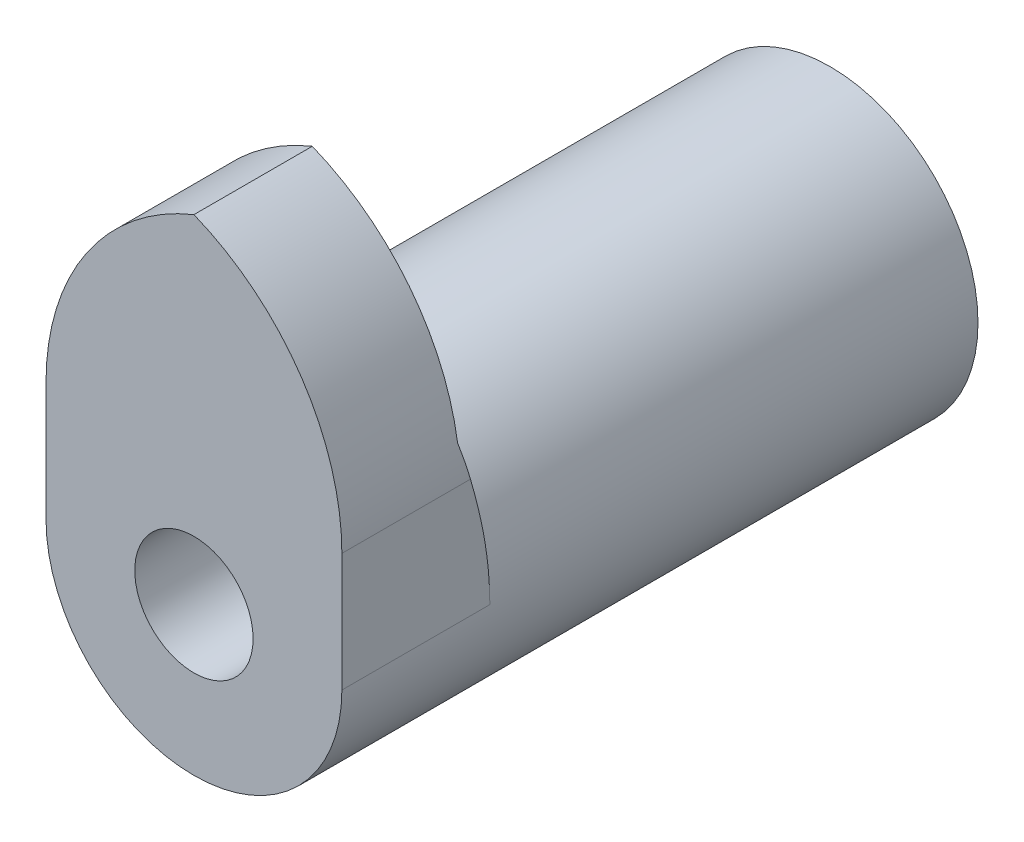
ISO-10303-21;
HEADER;
FILE_DESCRIPTION(('STEP AP214'),'2;1');
FILE_NAME('part.step','',(''),(''),'','','');
FILE_SCHEMA(('AUTOMOTIVE_DESIGN { 1 0 10303 214 1 1 1 1 }'));
ENDSEC;
DATA;
#1=APPLICATION_CONTEXT('core data for automotive mechanical design processes');
#2=APPLICATION_PROTOCOL_DEFINITION('international standard','automotive_design',2000,#1);
#3=PRODUCT_CONTEXT('',#1,'mechanical');
#4=PRODUCT('Part','Part','',(#3));
#5=PRODUCT_RELATED_PRODUCT_CATEGORY('part','',(#4));
#6=PRODUCT_DEFINITION_FORMATION('','',#4);
#7=PRODUCT_DEFINITION_CONTEXT('part definition',#1,'design');
#8=PRODUCT_DEFINITION('design','',#6,#7);
#9=PRODUCT_DEFINITION_SHAPE('','',#8);
#10=(LENGTH_UNIT() NAMED_UNIT(*) SI_UNIT(.MILLI.,.METRE.));
#11=(NAMED_UNIT(*) PLANE_ANGLE_UNIT() SI_UNIT($,.RADIAN.));
#12=(NAMED_UNIT(*) SI_UNIT($,.STERADIAN.) SOLID_ANGLE_UNIT());
#13=UNCERTAINTY_MEASURE_WITH_UNIT(LENGTH_MEASURE(1.E-05),#10,'distance_accuracy_value','');
#14=(GEOMETRIC_REPRESENTATION_CONTEXT(3) GLOBAL_UNCERTAINTY_ASSIGNED_CONTEXT((#13)) GLOBAL_UNIT_ASSIGNED_CONTEXT((#10,
#11,#12)) REPRESENTATION_CONTEXT('',''));
#15=CARTESIAN_POINT('',(0.,0.,0.));
#16=DIRECTION('',(0.,0.,1.));
#17=DIRECTION('',(1.,0.,0.));
#18=AXIS2_PLACEMENT_3D('',#15,#16,#17);
#19=CARTESIAN_POINT('',(0.,0.,21.5));
#20=DIRECTION('',(0.,0.,-1.));
#21=DIRECTION('',(-1.,0.,0.));
#22=AXIS2_PLACEMENT_3D('',#19,#20,#21);
#23=CYLINDRICAL_SURFACE('',#22,5.);
#24=CARTESIAN_POINT('',(0.,0.,0.));
#25=DIRECTION('',(0.,0.,1.));
#26=DIRECTION('',(1.,0.,0.));
#27=AXIS2_PLACEMENT_3D('',#24,#25,#26);
#28=CIRCLE('',#27,5.);
#29=CARTESIAN_POINT('',(5.,0.,0.));
#30=VERTEX_POINT('',#29);
#31=EDGE_CURVE('E123',#30,#30,#28,.T.);
#32=ORIENTED_EDGE('',*,*,#31,.T.);
#33=EDGE_LOOP('',(#32));
#34=FACE_BOUND('',#33,.T.);
#35=DIRECTION('',(0.,0.,1.));
#36=VECTOR('',#35,1.);
#37=CARTESIAN_POINT('',(-5.,0.,17.5));
#38=LINE('',#37,#36);
#39=CARTESIAN_POINT('',(-5.,0.,16.5));
#40=VERTEX_POINT('',#39);
#41=CARTESIAN_POINT('',(-5.,0.,21.5));
#42=VERTEX_POINT('',#41);
#43=EDGE_CURVE('E116',#40,#42,#38,.T.);
#44=ORIENTED_EDGE('',*,*,#43,.F.);
#45=CARTESIAN_POINT('',(0.,0.,16.5));
#46=DIRECTION('',(0.,0.,1.));
#47=DIRECTION('',(1.,0.,0.));
#48=AXIS2_PLACEMENT_3D('',#45,#46,#47);
#49=CIRCLE('',#48,5.);
#50=CARTESIAN_POINT('',(5.,0.,16.5));
#51=VERTEX_POINT('',#50);
#52=EDGE_CURVE('E113',#40,#51,#49,.F.);
#53=ORIENTED_EDGE('',*,*,#52,.T.);
#54=DIRECTION('',(0.,0.,1.));
#55=VECTOR('',#54,1.);
#56=CARTESIAN_POINT('',(5.,0.,17.5));
#57=LINE('',#56,#55);
#58=CARTESIAN_POINT('',(5.,0.,21.5));
#59=VERTEX_POINT('',#58);
#60=EDGE_CURVE('E100',#51,#59,#57,.T.);
#61=ORIENTED_EDGE('',*,*,#60,.T.);
#62=CARTESIAN_POINT('',(0.,0.,21.5));
#63=DIRECTION('',(0.,0.,1.));
#64=DIRECTION('',(1.,0.,0.));
#65=AXIS2_PLACEMENT_3D('',#62,#63,#64);
#66=CIRCLE('',#65,5.);
#67=EDGE_CURVE('E111',#42,#59,#66,.T.);
#68=ORIENTED_EDGE('',*,*,#67,.F.);
#69=EDGE_LOOP('',(#44,#53,#61,#68));
#70=FACE_BOUND('',#69,.T.);
#71=ADVANCED_FACE('F43',(#34,#70),#23,.T.);
#72=CARTESIAN_POINT('',(0.,0.,21.5));
#73=DIRECTION('',(0.,0.,1.));
#74=DIRECTION('',(1.,0.,0.));
#75=AXIS2_PLACEMENT_3D('',#72,#73,#74);
#76=PLANE('',#75);
#77=CARTESIAN_POINT('',(-3.,4.,21.5));
#78=DIRECTION('',(0.,0.,1.));
#79=DIRECTION('',(1.,0.,0.));
#80=AXIS2_PLACEMENT_3D('',#77,#78,#79);
#81=CIRCLE('',#80,8.);
#82=CARTESIAN_POINT('',(5.,4.,21.5));
#83=VERTEX_POINT('',#82);
#84=CARTESIAN_POINT('',(0.,11.4161984870957,21.5));
#85=VERTEX_POINT('',#84);
#86=EDGE_CURVE('E186',#83,#85,#81,.T.);
#87=ORIENTED_EDGE('',*,*,#86,.T.);
#88=CARTESIAN_POINT('',(3.,4.,21.5));
#89=DIRECTION('',(0.,0.,1.));
#90=DIRECTION('',(1.,0.,0.));
#91=AXIS2_PLACEMENT_3D('',#88,#89,#90);
#92=CIRCLE('',#91,8.);
#93=CARTESIAN_POINT('',(-5.,4.,21.5));
#94=VERTEX_POINT('',#93);
#95=EDGE_CURVE('E188',#85,#94,#92,.T.);
#96=ORIENTED_EDGE('',*,*,#95,.T.);
#97=DIRECTION('',(0.,1.,0.));
#98=VECTOR('',#97,1.);
#99=CARTESIAN_POINT('',(-5.,0.,21.5));
#100=LINE('',#99,#98);
#101=EDGE_CURVE('E106',#42,#94,#100,.T.);
#102=ORIENTED_EDGE('',*,*,#101,.F.);
#103=ORIENTED_EDGE('',*,*,#67,.T.);
#104=DIRECTION('',(0.,-1.,0.));
#105=VECTOR('',#104,1.);
#106=CARTESIAN_POINT('',(5.,0.,21.5));
#107=LINE('',#106,#105);
#108=EDGE_CURVE('E96',#83,#59,#107,.T.);
#109=ORIENTED_EDGE('',*,*,#108,.F.);
#110=EDGE_LOOP('',(#87,#96,#102,#103,#109));
#111=FACE_BOUND('',#110,.T.);
#112=CARTESIAN_POINT('',(0.,0.,21.5));
#113=DIRECTION('',(0.,0.,1.));
#114=DIRECTION('',(1.,0.,0.));
#115=AXIS2_PLACEMENT_3D('',#112,#113,#114);
#116=CIRCLE('',#115,2.);
#117=CARTESIAN_POINT('',(2.,0.,21.5));
#118=VERTEX_POINT('',#117);
#119=EDGE_CURVE('E127',#118,#118,#116,.T.);
#120=ORIENTED_EDGE('',*,*,#119,.F.);
#121=EDGE_LOOP('',(#120));
#122=FACE_BOUND('',#121,.T.);
#123=ADVANCED_FACE('F118',(#111,#122),#76,.T.);
#124=CARTESIAN_POINT('',(0.,0.,0.));
#125=DIRECTION('',(0.,0.,1.));
#126=DIRECTION('',(1.,0.,0.));
#127=AXIS2_PLACEMENT_3D('',#124,#125,#126);
#128=PLANE('',#127);
#129=ORIENTED_EDGE('',*,*,#31,.F.);
#130=EDGE_LOOP('',(#129));
#131=FACE_BOUND('',#130,.T.);
#132=CARTESIAN_POINT('',(0.,0.,0.));
#133=DIRECTION('',(0.,0.,1.));
#134=DIRECTION('',(1.,0.,0.));
#135=AXIS2_PLACEMENT_3D('',#132,#133,#134);
#136=CIRCLE('',#135,2.);
#137=CARTESIAN_POINT('',(2.,0.,0.));
#138=VERTEX_POINT('',#137);
#139=EDGE_CURVE('E115',#138,#138,#136,.T.);
#140=ORIENTED_EDGE('',*,*,#139,.T.);
#141=EDGE_LOOP('',(#140));
#142=FACE_BOUND('',#141,.T.);
#143=ADVANCED_FACE('F200',(#131,#142),#128,.F.);
#144=CARTESIAN_POINT('',(0.,0.,21.5));
#145=DIRECTION('',(0.,0.,-1.));
#146=DIRECTION('',(-1.,0.,0.));
#147=AXIS2_PLACEMENT_3D('',#144,#145,#146);
#148=CYLINDRICAL_SURFACE('',#147,2.);
#149=ORIENTED_EDGE('',*,*,#119,.T.);
#150=EDGE_LOOP('',(#149));
#151=FACE_BOUND('',#150,.T.);
#152=ORIENTED_EDGE('',*,*,#139,.F.);
#153=EDGE_LOOP('',(#152));
#154=FACE_BOUND('',#153,.T.);
#155=ADVANCED_FACE('F202',(#151,#154),#148,.F.);
#156=CARTESIAN_POINT('',(5.,0.,17.5));
#157=DIRECTION('',(-1.,0.,0.));
#158=DIRECTION('',(0.,0.,1.));
#159=AXIS2_PLACEMENT_3D('',#156,#157,#158);
#160=PLANE('',#159);
#161=CARTESIAN_POINT('',(5.,0.,16.5));
#162=CARTESIAN_POINT('',(5.,0.0874817058937852,16.499997095422));
#163=CARTESIAN_POINT('',(5.,0.174959774866362,16.5010709708579));
#164=CARTESIAN_POINT('',(5.,0.349860815592275,16.5053465241394));
#165=CARTESIAN_POINT('',(5.,0.437283789233235,16.5085481246194));
#166=CARTESIAN_POINT('',(5.,0.699315430332085,16.5213014988497));
#167=CARTESIAN_POINT('',(5.,0.873779473072869,16.5340018979144));
#168=CARTESIAN_POINT('',(5.,1.22140659670048,16.5672488332378));
#169=CARTESIAN_POINT('',(5.,1.39457201963819,16.587771417855));
#170=CARTESIAN_POINT('',(5.,1.73992098196719,16.6359371518027));
#171=CARTESIAN_POINT('',(5.,1.9121044073773,16.6635811111897));
#172=CARTESIAN_POINT('',(5.,2.25401895456,16.7249111430144));
#173=CARTESIAN_POINT('',(5.,2.42375875652857,16.7585492595013));
#174=CARTESIAN_POINT('',(5.,2.76207531088115,16.8311778009846));
#175=CARTESIAN_POINT('',(5.,2.93065208162815,16.8701681412713));
#176=CARTESIAN_POINT('',(5.,3.4348857322479,16.9940136096518));
#177=CARTESIAN_POINT('',(5.,3.76886762837503,17.0857095038762));
#178=CARTESIAN_POINT('',(5.,4.26871139930733,17.2335315383338));
#179=CARTESIAN_POINT('',(5.,4.4360493794505,17.2848277071709));
#180=CARTESIAN_POINT('',(5.,4.77016503510591,17.3903538704735));
#181=CARTESIAN_POINT('',(5.,4.9369409357545,17.4445894938397));
#182=CARTESIAN_POINT('',(5.,5.10333020068362,17.5));
#183=B_SPLINE_CURVE_WITH_KNOTS('',3,(#161,#162,#163,#164,#165,#166,#167,#168,#169,#170,#171,
#172,#173,#174,#175,#176,#177,#178,#179,#180,#181,#182),.UNSPECIFIED.,.F.,.F.,(4,2,2,2,2,2,2,2,
2,2,4),(0.,0.262431502923744,0.52485346417424,1.04941971898994,1.57239248326622,
2.09542476198059,2.61444646053517,3.13345994546293,4.17203053696985,4.69708837181518,
5.22318986493661),.UNSPECIFIED.);
#184=CARTESIAN_POINT('',(5.,4.00000000000003,17.1542875772578));
#185=VERTEX_POINT('',#184);
#186=EDGE_CURVE('E141',#51,#185,#183,.T.);
#187=ORIENTED_EDGE('',*,*,#186,.T.);
#188=DIRECTION('',(0.,0.,1.));
#189=VECTOR('',#188,1.);
#190=CARTESIAN_POINT('',(5.,4.,17.5));
#191=LINE('',#190,#189);
#192=EDGE_CURVE('E11',#185,#83,#191,.T.);
#193=ORIENTED_EDGE('',*,*,#192,.T.);
#194=ORIENTED_EDGE('',*,*,#108,.T.);
#195=ORIENTED_EDGE('',*,*,#60,.F.);
#196=EDGE_LOOP('',(#187,#193,#194,#195));
#197=FACE_BOUND('',#196,.T.);
#198=ADVANCED_FACE('F99',(#197),#160,.F.);
#199=CARTESIAN_POINT('',(-5.,0.,17.5));
#200=DIRECTION('',(1.,0.,0.));
#201=DIRECTION('',(0.,0.,-1.));
#202=AXIS2_PLACEMENT_3D('',#199,#200,#201);
#203=PLANE('',#202);
#204=ORIENTED_EDGE('',*,*,#101,.T.);
#205=DIRECTION('',(0.,0.,1.));
#206=VECTOR('',#205,1.);
#207=CARTESIAN_POINT('',(-5.,4.,17.5));
#208=LINE('',#207,#206);
#209=CARTESIAN_POINT('',(-5.,4.,17.1542875772578));
#210=VERTEX_POINT('',#209);
#211=EDGE_CURVE('E173',#94,#210,#208,.F.);
#212=ORIENTED_EDGE('',*,*,#211,.T.);
#213=CARTESIAN_POINT('',(-5.,5.10333020068362,17.5));
#214=CARTESIAN_POINT('',(-5.,4.89661706891432,17.4311858270843));
#215=CARTESIAN_POINT('',(-5.,4.68928947391501,17.3641407899535));
#216=CARTESIAN_POINT('',(-5.,4.27313648022872,17.2346031153735));
#217=CARTESIAN_POINT('',(-5.,4.064310553693,17.172112178491));
#218=CARTESIAN_POINT('',(-5.,3.64642620854322,17.0531426369576));
#219=CARTESIAN_POINT('',(-5.,3.43737838240002,16.9966271397928));
#220=CARTESIAN_POINT('',(-5.,3.01753946481119,16.8904537995628));
#221=CARTESIAN_POINT('',(-5.,2.80674842742297,16.8407957446856));
#222=CARTESIAN_POINT('',(-5.,2.38254807234195,16.7496747858386));
#223=CARTESIAN_POINT('',(-5.,2.16913185637744,16.7082436784247));
#224=CARTESIAN_POINT('',(-5.,1.74059626866278,16.6354859752691));
#225=CARTESIAN_POINT('',(-5.,1.52547730720159,16.6041570169785));
#226=CARTESIAN_POINT('',(-5.,1.20108959057802,16.5658255060414));
#227=CARTESIAN_POINT('',(-5.,1.09232536457492,16.5544697356731));
#228=CARTESIAN_POINT('',(-5.,0.874515459264744,16.5348691442045));
#229=CARTESIAN_POINT('',(-5.,0.765469785091225,16.5266242667604));
#230=CARTESIAN_POINT('',(-5.,0.547075895872186,16.513371396122));
#231=CARTESIAN_POINT('',(-5.,0.437727490617458,16.508366527269));
#232=CARTESIAN_POINT('',(-5.,0.218920143841929,16.5016759281345));
#233=CARTESIAN_POINT('',(-5.,0.109461193652273,16.4999904823042));
#234=CARTESIAN_POINT('',(-5.,0.,16.5));
#235=B_SPLINE_CURVE_WITH_KNOTS('',3,(#213,#214,#215,#216,#217,#218,#219,#220,#221,#222,#223,
#224,#225,#226,#227,#228,#229,#230,#231,#232,#233,#234),.UNSPECIFIED.,.F.,.F.,(4,2,2,2,2,2,2,2,
2,2,4),(0.,0.653627221273575,1.30749727887756,1.95706020950977,2.60660307200837,3.2586094933978,
3.91046332189015,4.23849218493054,4.56651510648381,4.89485387131676,5.22322077122947),.UNSPECIFIED.);
#236=EDGE_CURVE('E133',#210,#40,#235,.T.);
#237=ORIENTED_EDGE('',*,*,#236,.T.);
#238=ORIENTED_EDGE('',*,*,#43,.T.);
#239=EDGE_LOOP('',(#204,#212,#237,#238));
#240=FACE_BOUND('',#239,.T.);
#241=ADVANCED_FACE('F148',(#240),#203,.F.);
#242=CARTESIAN_POINT('',(0.,0.,17.5));
#243=DIRECTION('',(0.,0.,1.));
#244=DIRECTION('',(1.,0.,0.));
#245=AXIS2_PLACEMENT_3D('',#242,#243,#244);
#246=PLANE('',#245);
#247=CARTESIAN_POINT('',(0.,0.,17.5));
#248=DIRECTION('',(0.,0.,1.));
#249=DIRECTION('',(1.,0.,0.));
#250=AXIS2_PLACEMENT_3D('',#247,#248,#249);
#251=CIRCLE('',#250,7.14450692050959);
#252=CARTESIAN_POINT('',(4.91116805300634,5.18887343190594,17.5));
#253=VERTEX_POINT('',#252);
#254=CARTESIAN_POINT('',(-4.91116805300634,5.18887343190594,17.5));
#255=VERTEX_POINT('',#254);
#256=EDGE_CURVE('E122',#253,#255,#251,.T.);
#257=ORIENTED_EDGE('',*,*,#256,.T.);
#258=CARTESIAN_POINT('',(3.,4.,17.5));
#259=DIRECTION('',(0.,0.,1.));
#260=DIRECTION('',(1.,0.,0.));
#261=AXIS2_PLACEMENT_3D('',#258,#259,#260);
#262=CIRCLE('',#261,8.);
#263=CARTESIAN_POINT('',(0.,11.4161984870957,17.5));
#264=VERTEX_POINT('',#263);
#265=EDGE_CURVE('E53',#255,#264,#262,.F.);
#266=ORIENTED_EDGE('',*,*,#265,.T.);
#267=CARTESIAN_POINT('',(-3.,4.,17.5));
#268=DIRECTION('',(0.,0.,1.));
#269=DIRECTION('',(1.,0.,0.));
#270=AXIS2_PLACEMENT_3D('',#267,#268,#269);
#271=CIRCLE('',#270,8.);
#272=EDGE_CURVE('E180',#264,#253,#271,.F.);
#273=ORIENTED_EDGE('',*,*,#272,.T.);
#274=EDGE_LOOP('',(#257,#266,#273));
#275=FACE_BOUND('',#274,.T.);
#276=ADVANCED_FACE('F158',(#275),#246,.F.);
#277=CARTESIAN_POINT('',(0.,0.,17.5));
#278=DIRECTION('',(0.,0.,1.));
#279=DIRECTION('',(1.,0.,0.));
#280=AXIS2_PLACEMENT_3D('',#277,#278,#279);
#281=CONICAL_SURFACE('',#280,7.14450692050959,1.13446401379632);
#282=ORIENTED_EDGE('',*,*,#236,.F.);
#283=CARTESIAN_POINT('',(-5.,4.,17.1542875772578));
#284=CARTESIAN_POINT('',(-4.99998744338404,4.19914240376959,17.2122789122803));
#285=CARTESIAN_POINT('',(-4.99257851155346,4.39778633351815,17.2700839314747));
#286=CARTESIAN_POINT('',(-4.9629678800019,4.79407747866258,17.3853214061616));
#287=CARTESIAN_POINT('',(-4.9407661628346,4.99172469288267,17.4427538612146));
#288=CARTESIAN_POINT('',(-4.91116805300634,5.18887343190594,17.5));
#289=B_SPLINE_CURVE_WITH_KNOTS('',3,(#283,#284,#285,#286,#287,#288),.UNSPECIFIED.,.F.,.F.,(4,2,
4),(0.,0.621048717950466,1.2420981683552),.UNSPECIFIED.);
#290=EDGE_CURVE('E67',#210,#255,#289,.T.);
#291=ORIENTED_EDGE('',*,*,#290,.T.);
#292=ORIENTED_EDGE('',*,*,#256,.F.);
#293=CARTESIAN_POINT('',(4.91116805300634,5.18887343190594,17.5));
#294=CARTESIAN_POINT('',(4.94076616283466,4.9917246928823,17.4427538612145));
#295=CARTESIAN_POINT('',(4.96296788000198,4.79407747866184,17.3853214061613));
#296=CARTESIAN_POINT('',(4.99257851155354,4.39778633351667,17.2700839314743));
#297=CARTESIAN_POINT('',(4.9999874433841,4.19914240376775,17.2122789122798));
#298=CARTESIAN_POINT('',(5.,3.99999999999779,17.1542875772572));
#299=B_SPLINE_CURVE_WITH_KNOTS('',3,(#293,#294,#295,#296,#297,#298),.UNSPECIFIED.,.F.,.F.,(4,2,
4),(0.,0.62104945040589,1.24209816835751),.UNSPECIFIED.);
#300=EDGE_CURVE('E167',#253,#185,#299,.T.);
#301=ORIENTED_EDGE('',*,*,#300,.T.);
#302=ORIENTED_EDGE('',*,*,#186,.F.);
#303=ORIENTED_EDGE('',*,*,#52,.F.);
#304=EDGE_LOOP('',(#282,#291,#292,#301,#302,#303));
#305=FACE_BOUND('',#304,.T.);
#306=ADVANCED_FACE('F152',(#305),#281,.T.);
#307=CARTESIAN_POINT('',(-3.,4.,17.5));
#308=DIRECTION('',(0.,0.,1.));
#309=DIRECTION('',(1.,0.,0.));
#310=AXIS2_PLACEMENT_3D('',#307,#308,#309);
#311=CYLINDRICAL_SURFACE('',#310,8.);
#312=ORIENTED_EDGE('',*,*,#300,.F.);
#313=ORIENTED_EDGE('',*,*,#272,.F.);
#314=DIRECTION('',(0.,0.,1.));
#315=VECTOR('',#314,1.);
#316=CARTESIAN_POINT('',(0.,11.4161984870957,19.3141066513565));
#317=LINE('',#316,#315);
#318=EDGE_CURVE('E48',#85,#264,#317,.F.);
#319=ORIENTED_EDGE('',*,*,#318,.F.);
#320=ORIENTED_EDGE('',*,*,#86,.F.);
#321=ORIENTED_EDGE('',*,*,#192,.F.);
#322=EDGE_LOOP('',(#312,#313,#319,#320,#321));
#323=FACE_BOUND('',#322,.T.);
#324=ADVANCED_FACE('F45',(#323),#311,.T.);
#325=CARTESIAN_POINT('',(3.,4.,17.5));
#326=DIRECTION('',(0.,0.,1.));
#327=DIRECTION('',(1.,0.,0.));
#328=AXIS2_PLACEMENT_3D('',#325,#326,#327);
#329=CYLINDRICAL_SURFACE('',#328,8.);
#330=ORIENTED_EDGE('',*,*,#290,.F.);
#331=ORIENTED_EDGE('',*,*,#211,.F.);
#332=ORIENTED_EDGE('',*,*,#95,.F.);
#333=ORIENTED_EDGE('',*,*,#318,.T.);
#334=ORIENTED_EDGE('',*,*,#265,.F.);
#335=EDGE_LOOP('',(#330,#331,#332,#333,#334));
#336=FACE_BOUND('',#335,.T.);
#337=ADVANCED_FACE('F160',(#336),#329,.T.);
#338=CLOSED_SHELL('',(#71,#123,#143,#155,#198,#241,#276,#306,#324,#337));
#339=MANIFOLD_SOLID_BREP('B2',#338);
#340=ADVANCED_BREP_SHAPE_REPRESENTATION('',(#18,#339),#14);
#341=SHAPE_DEFINITION_REPRESENTATION(#9,#340);
ENDSEC;
END-ISO-10303-21;
